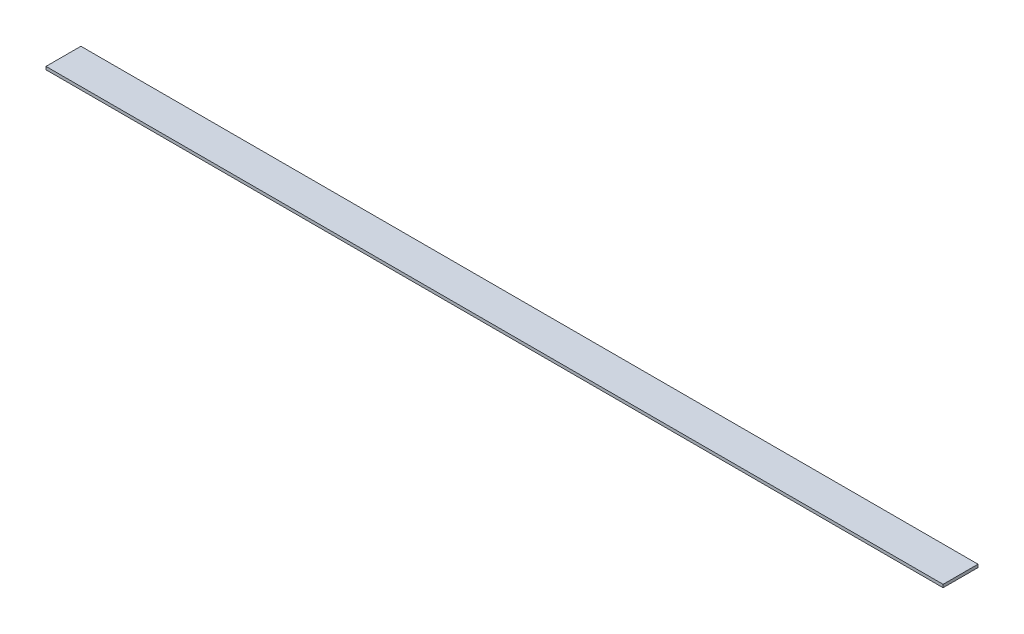
ISO-10303-21;
HEADER;
FILE_DESCRIPTION(('STEP AP214'),'2;1');
FILE_NAME('part.step','',(''),(''),'','','');
FILE_SCHEMA(('AUTOMOTIVE_DESIGN { 1 0 10303 214 1 1 1 1 }'));
ENDSEC;
DATA;
#1=APPLICATION_CONTEXT('core data for automotive mechanical design processes');
#2=APPLICATION_PROTOCOL_DEFINITION('international standard','automotive_design',2000,#1);
#3=PRODUCT_CONTEXT('',#1,'mechanical');
#4=PRODUCT('Part','Part','',(#3));
#5=PRODUCT_RELATED_PRODUCT_CATEGORY('part','',(#4));
#6=PRODUCT_DEFINITION_FORMATION('','',#4);
#7=PRODUCT_DEFINITION_CONTEXT('part definition',#1,'design');
#8=PRODUCT_DEFINITION('design','',#6,#7);
#9=PRODUCT_DEFINITION_SHAPE('','',#8);
#10=(LENGTH_UNIT() NAMED_UNIT(*) SI_UNIT(.MILLI.,.METRE.));
#11=(NAMED_UNIT(*) PLANE_ANGLE_UNIT() SI_UNIT($,.RADIAN.));
#12=(NAMED_UNIT(*) SI_UNIT($,.STERADIAN.) SOLID_ANGLE_UNIT());
#13=UNCERTAINTY_MEASURE_WITH_UNIT(LENGTH_MEASURE(1.E-05),#10,'distance_accuracy_value','');
#14=(GEOMETRIC_REPRESENTATION_CONTEXT(3) GLOBAL_UNCERTAINTY_ASSIGNED_CONTEXT((#13)) GLOBAL_UNIT_ASSIGNED_CONTEXT((#10,
#11,#12)) REPRESENTATION_CONTEXT('',''));
#15=CARTESIAN_POINT('',(0.,0.,0.));
#16=DIRECTION('',(0.,0.,1.));
#17=DIRECTION('',(1.,0.,0.));
#18=AXIS2_PLACEMENT_3D('',#15,#16,#17);
#19=CARTESIAN_POINT('',(450.,1.5,17.5));
#20=DIRECTION('',(-1.,0.,0.));
#21=DIRECTION('',(0.,0.,1.));
#22=AXIS2_PLACEMENT_3D('',#19,#20,#21);
#23=PLANE('',#22);
#24=DIRECTION('',(0.,0.,-1.));
#25=VECTOR('',#24,1.);
#26=CARTESIAN_POINT('',(450.,-1.5,17.5));
#27=LINE('',#26,#25);
#28=CARTESIAN_POINT('',(450.,-1.5,17.5));
#29=VERTEX_POINT('',#28);
#30=CARTESIAN_POINT('',(450.,-1.5,-17.5));
#31=VERTEX_POINT('',#30);
#32=EDGE_CURVE('E98',#29,#31,#27,.T.);
#33=ORIENTED_EDGE('',*,*,#32,.T.);
#34=DIRECTION('',(0.,-1.,0.));
#35=VECTOR('',#34,1.);
#36=CARTESIAN_POINT('',(450.,1.5,-17.5));
#37=LINE('',#36,#35);
#38=CARTESIAN_POINT('',(450.,1.5,-17.5));
#39=VERTEX_POINT('',#38);
#40=EDGE_CURVE('E11',#39,#31,#37,.T.);
#41=ORIENTED_EDGE('',*,*,#40,.F.);
#42=DIRECTION('',(0.,0.,-1.));
#43=VECTOR('',#42,1.);
#44=CARTESIAN_POINT('',(450.,1.5,17.5));
#45=LINE('',#44,#43);
#46=CARTESIAN_POINT('',(450.,1.5,17.5));
#47=VERTEX_POINT('',#46);
#48=EDGE_CURVE('E86',#47,#39,#45,.T.);
#49=ORIENTED_EDGE('',*,*,#48,.F.);
#50=DIRECTION('',(0.,-1.,0.));
#51=VECTOR('',#50,1.);
#52=CARTESIAN_POINT('',(450.,1.5,17.5));
#53=LINE('',#52,#51);
#54=EDGE_CURVE('E94',#47,#29,#53,.T.);
#55=ORIENTED_EDGE('',*,*,#54,.T.);
#56=EDGE_LOOP('',(#33,#41,#49,#55));
#57=FACE_BOUND('',#56,.T.);
#58=ADVANCED_FACE('F35',(#57),#23,.F.);
#59=CARTESIAN_POINT('',(-450.,1.5,-17.5));
#60=DIRECTION('',(0.,0.,1.));
#61=DIRECTION('',(1.,0.,0.));
#62=AXIS2_PLACEMENT_3D('',#59,#60,#61);
#63=PLANE('',#62);
#64=DIRECTION('',(-1.,0.,0.));
#65=VECTOR('',#64,1.);
#66=CARTESIAN_POINT('',(-450.,-1.5,-17.5));
#67=LINE('',#66,#65);
#68=CARTESIAN_POINT('',(-450.,-1.5,-17.5));
#69=VERTEX_POINT('',#68);
#70=EDGE_CURVE('E90',#31,#69,#67,.T.);
#71=ORIENTED_EDGE('',*,*,#70,.T.);
#72=DIRECTION('',(0.,-1.,0.));
#73=VECTOR('',#72,1.);
#74=CARTESIAN_POINT('',(-450.,1.5,-17.5));
#75=LINE('',#74,#73);
#76=CARTESIAN_POINT('',(-450.,1.5,-17.5));
#77=VERTEX_POINT('',#76);
#78=EDGE_CURVE('E43',#77,#69,#75,.T.);
#79=ORIENTED_EDGE('',*,*,#78,.F.);
#80=DIRECTION('',(-1.,0.,0.));
#81=VECTOR('',#80,1.);
#82=CARTESIAN_POINT('',(-450.,1.5,-17.5));
#83=LINE('',#82,#81);
#84=EDGE_CURVE('E81',#39,#77,#83,.T.);
#85=ORIENTED_EDGE('',*,*,#84,.F.);
#86=ORIENTED_EDGE('',*,*,#40,.T.);
#87=EDGE_LOOP('',(#71,#79,#85,#86));
#88=FACE_BOUND('',#87,.T.);
#89=ADVANCED_FACE('F89',(#88),#63,.F.);
#90=CARTESIAN_POINT('',(-450.,1.5,17.5));
#91=DIRECTION('',(1.,0.,0.));
#92=DIRECTION('',(0.,0.,-1.));
#93=AXIS2_PLACEMENT_3D('',#90,#91,#92);
#94=PLANE('',#93);
#95=DIRECTION('',(0.,0.,1.));
#96=VECTOR('',#95,1.);
#97=CARTESIAN_POINT('',(-450.,-1.5,17.5));
#98=LINE('',#97,#96);
#99=CARTESIAN_POINT('',(-450.,-1.5,17.5));
#100=VERTEX_POINT('',#99);
#101=EDGE_CURVE('E68',#69,#100,#98,.T.);
#102=ORIENTED_EDGE('',*,*,#101,.T.);
#103=DIRECTION('',(0.,-1.,0.));
#104=VECTOR('',#103,1.);
#105=CARTESIAN_POINT('',(-450.,1.5,17.5));
#106=LINE('',#105,#104);
#107=CARTESIAN_POINT('',(-450.,1.5,17.5));
#108=VERTEX_POINT('',#107);
#109=EDGE_CURVE('E91',#108,#100,#106,.T.);
#110=ORIENTED_EDGE('',*,*,#109,.F.);
#111=DIRECTION('',(0.,0.,1.));
#112=VECTOR('',#111,1.);
#113=CARTESIAN_POINT('',(-450.,1.5,17.5));
#114=LINE('',#113,#112);
#115=EDGE_CURVE('E84',#77,#108,#114,.T.);
#116=ORIENTED_EDGE('',*,*,#115,.F.);
#117=ORIENTED_EDGE('',*,*,#78,.T.);
#118=EDGE_LOOP('',(#102,#110,#116,#117));
#119=FACE_BOUND('',#118,.T.);
#120=ADVANCED_FACE('F92',(#119),#94,.F.);
#121=CARTESIAN_POINT('',(-450.,1.5,17.5));
#122=DIRECTION('',(0.,0.,-1.));
#123=DIRECTION('',(-1.,0.,0.));
#124=AXIS2_PLACEMENT_3D('',#121,#122,#123);
#125=PLANE('',#124);
#126=DIRECTION('',(1.,0.,0.));
#127=VECTOR('',#126,1.);
#128=CARTESIAN_POINT('',(-450.,-1.5,17.5));
#129=LINE('',#128,#127);
#130=EDGE_CURVE('E74',#100,#29,#129,.T.);
#131=ORIENTED_EDGE('',*,*,#130,.T.);
#132=ORIENTED_EDGE('',*,*,#54,.F.);
#133=DIRECTION('',(1.,0.,0.));
#134=VECTOR('',#133,1.);
#135=CARTESIAN_POINT('',(-450.,1.5,17.5));
#136=LINE('',#135,#134);
#137=EDGE_CURVE('E51',#108,#47,#136,.T.);
#138=ORIENTED_EDGE('',*,*,#137,.F.);
#139=ORIENTED_EDGE('',*,*,#109,.T.);
#140=EDGE_LOOP('',(#131,#132,#138,#139));
#141=FACE_BOUND('',#140,.T.);
#142=ADVANCED_FACE('F105',(#141),#125,.F.);
#143=CARTESIAN_POINT('',(0.,1.5,0.));
#144=DIRECTION('',(0.,-1.,0.));
#145=DIRECTION('',(0.,0.,-1.));
#146=AXIS2_PLACEMENT_3D('',#143,#144,#145);
#147=PLANE('',#146);
#148=ORIENTED_EDGE('',*,*,#48,.T.);
#149=ORIENTED_EDGE('',*,*,#84,.T.);
#150=ORIENTED_EDGE('',*,*,#115,.T.);
#151=ORIENTED_EDGE('',*,*,#137,.T.);
#152=EDGE_LOOP('',(#148,#149,#150,#151));
#153=FACE_BOUND('',#152,.T.);
#154=ADVANCED_FACE('F82',(#153),#147,.F.);
#155=CARTESIAN_POINT('',(0.,-1.5,0.));
#156=DIRECTION('',(0.,-1.,0.));
#157=DIRECTION('',(0.,0.,-1.));
#158=AXIS2_PLACEMENT_3D('',#155,#156,#157);
#159=PLANE('',#158);
#160=ORIENTED_EDGE('',*,*,#32,.F.);
#161=ORIENTED_EDGE('',*,*,#130,.F.);
#162=ORIENTED_EDGE('',*,*,#101,.F.);
#163=ORIENTED_EDGE('',*,*,#70,.F.);
#164=EDGE_LOOP('',(#160,#161,#162,#163));
#165=FACE_BOUND('',#164,.T.);
#166=ADVANCED_FACE('F108',(#165),#159,.T.);
#167=CLOSED_SHELL('',(#58,#89,#120,#142,#154,#166));
#168=MANIFOLD_SOLID_BREP('B2',#167);
#169=ADVANCED_BREP_SHAPE_REPRESENTATION('',(#18,#168),#14);
#170=SHAPE_DEFINITION_REPRESENTATION(#9,#169);
ENDSEC;
END-ISO-10303-21;
